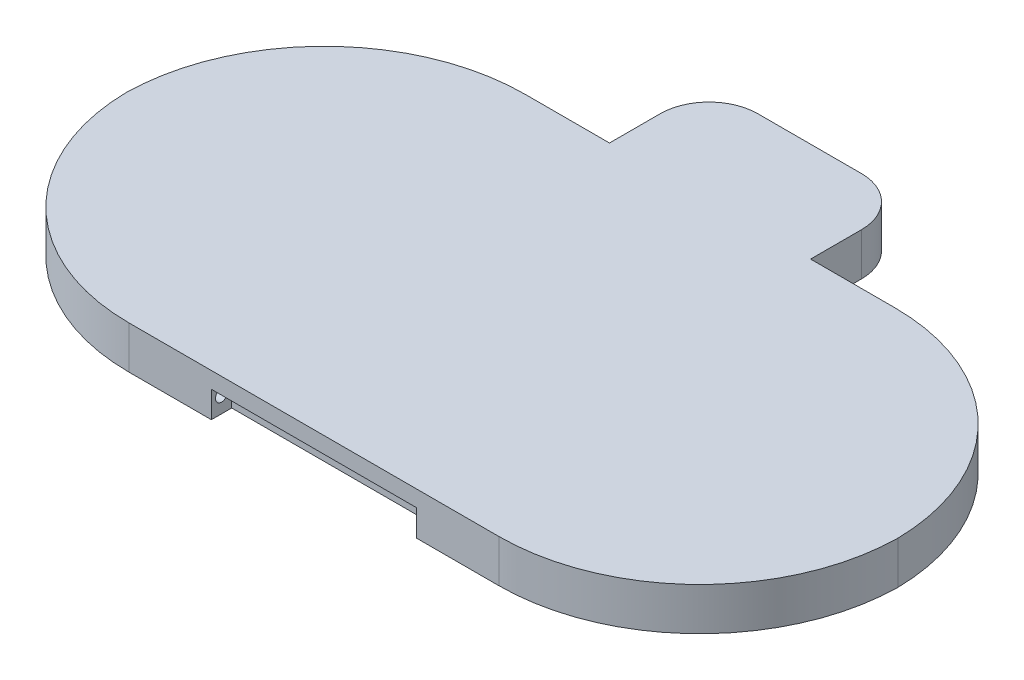
ISO-10303-21;
HEADER;
FILE_DESCRIPTION(('STEP AP214'),'2;1');
FILE_NAME('part.step','',(''),(''),'','','');
FILE_SCHEMA(('AUTOMOTIVE_DESIGN { 1 0 10303 214 1 1 1 1 }'));
ENDSEC;
DATA;
#1=APPLICATION_CONTEXT('core data for automotive mechanical design processes');
#2=APPLICATION_PROTOCOL_DEFINITION('international standard','automotive_design',2000,#1);
#3=PRODUCT_CONTEXT('',#1,'mechanical');
#4=PRODUCT('Part','Part','',(#3));
#5=PRODUCT_RELATED_PRODUCT_CATEGORY('part','',(#4));
#6=PRODUCT_DEFINITION_FORMATION('','',#4);
#7=PRODUCT_DEFINITION_CONTEXT('part definition',#1,'design');
#8=PRODUCT_DEFINITION('design','',#6,#7);
#9=PRODUCT_DEFINITION_SHAPE('','',#8);
#10=(LENGTH_UNIT() NAMED_UNIT(*) SI_UNIT(.MILLI.,.METRE.));
#11=(NAMED_UNIT(*) PLANE_ANGLE_UNIT() SI_UNIT($,.RADIAN.));
#12=(NAMED_UNIT(*) SI_UNIT($,.STERADIAN.) SOLID_ANGLE_UNIT());
#13=UNCERTAINTY_MEASURE_WITH_UNIT(LENGTH_MEASURE(1.E-05),#10,'distance_accuracy_value','');
#14=(GEOMETRIC_REPRESENTATION_CONTEXT(3) GLOBAL_UNCERTAINTY_ASSIGNED_CONTEXT((#13)) GLOBAL_UNIT_ASSIGNED_CONTEXT((#10,
#11,#12)) REPRESENTATION_CONTEXT('',''));
#15=CARTESIAN_POINT('',(0.,0.,0.));
#16=DIRECTION('',(0.,0.,1.));
#17=DIRECTION('',(1.,0.,0.));
#18=AXIS2_PLACEMENT_3D('',#15,#16,#17);
#19=CARTESIAN_POINT('',(190.,21.,-97.5));
#20=DIRECTION('',(0.,0.,1.));
#21=DIRECTION('',(1.,0.,0.));
#22=AXIS2_PLACEMENT_3D('',#19,#20,#21);
#23=PLANE('',#22);
#24=DIRECTION('',(0.,-1.,0.));
#25=VECTOR('',#24,1.);
#26=CARTESIAN_POINT('',(49.5,21.,-97.5));
#27=LINE('',#26,#25);
#28=CARTESIAN_POINT('',(49.5,21.,-97.5));
#29=VERTEX_POINT('',#28);
#30=CARTESIAN_POINT('',(49.5,0.,-97.5));
#31=VERTEX_POINT('',#30);
#32=EDGE_CURVE('E198',#29,#31,#27,.T.);
#33=ORIENTED_EDGE('',*,*,#32,.F.);
#34=DIRECTION('',(-1.,0.,0.));
#35=VECTOR('',#34,1.);
#36=CARTESIAN_POINT('',(190.,21.,-97.5));
#37=LINE('',#36,#35);
#38=CARTESIAN_POINT('',(91.,21.,-97.5));
#39=VERTEX_POINT('',#38);
#40=EDGE_CURVE('E262',#39,#29,#37,.T.);
#41=ORIENTED_EDGE('',*,*,#40,.F.);
#42=DIRECTION('',(0.,-1.,0.));
#43=VECTOR('',#42,1.);
#44=CARTESIAN_POINT('',(91.,21.,-97.5));
#45=LINE('',#44,#43);
#46=CARTESIAN_POINT('',(91.,0.,-97.5));
#47=VERTEX_POINT('',#46);
#48=EDGE_CURVE('E303',#39,#47,#45,.T.);
#49=ORIENTED_EDGE('',*,*,#48,.T.);
#50=DIRECTION('',(-1.,0.,0.));
#51=VECTOR('',#50,1.);
#52=CARTESIAN_POINT('',(190.,0.,-97.5));
#53=LINE('',#52,#51);
#54=EDGE_CURVE('E190',#47,#31,#53,.T.);
#55=ORIENTED_EDGE('',*,*,#54,.T.);
#56=EDGE_LOOP('',(#33,#41,#49,#55));
#57=FACE_BOUND('',#56,.T.);
#58=ADVANCED_FACE('F47',(#57),#23,.F.);
#59=DIRECTION('',(0.,1.,0.));
#60=VECTOR('',#59,1.);
#61=CARTESIAN_POINT('',(-49.5,21.,-97.5));
#62=LINE('',#61,#60);
#63=CARTESIAN_POINT('',(-49.5,0.,-97.5));
#64=VERTEX_POINT('',#63);
#65=CARTESIAN_POINT('',(-49.5,21.,-97.5));
#66=VERTEX_POINT('',#65);
#67=EDGE_CURVE('E175',#64,#66,#62,.T.);
#68=ORIENTED_EDGE('',*,*,#67,.F.);
#69=CARTESIAN_POINT('',(-91.0000000000001,0.,-97.5));
#70=VERTEX_POINT('',#69);
#71=EDGE_CURVE('E182',#64,#70,#53,.T.);
#72=ORIENTED_EDGE('',*,*,#71,.T.);
#73=DIRECTION('',(0.,-1.,0.));
#74=VECTOR('',#73,1.);
#75=CARTESIAN_POINT('',(-91.0000000000001,21.,-97.5));
#76=LINE('',#75,#74);
#77=CARTESIAN_POINT('',(-91.0000000000001,21.,-97.5));
#78=VERTEX_POINT('',#77);
#79=EDGE_CURVE('E307',#70,#78,#76,.F.);
#80=ORIENTED_EDGE('',*,*,#79,.T.);
#81=EDGE_CURVE('E195',#66,#78,#37,.T.);
#82=ORIENTED_EDGE('',*,*,#81,.F.);
#83=EDGE_LOOP('',(#68,#72,#80,#82));
#84=FACE_BOUND('',#83,.T.);
#85=ADVANCED_FACE('F194',(#84),#23,.F.);
#86=CARTESIAN_POINT('',(190.,21.,97.5));
#87=DIRECTION('',(0.,0.,-1.));
#88=DIRECTION('',(-1.,0.,0.));
#89=AXIS2_PLACEMENT_3D('',#86,#87,#88);
#90=PLANE('',#89);
#91=DIRECTION('',(1.,0.,0.));
#92=VECTOR('',#91,1.);
#93=CARTESIAN_POINT('',(190.,0.,97.5));
#94=LINE('',#93,#92);
#95=CARTESIAN_POINT('',(-91.,0.,97.5));
#96=VERTEX_POINT('',#95);
#97=CARTESIAN_POINT('',(-50.5,0.,97.5));
#98=VERTEX_POINT('',#97);
#99=EDGE_CURVE('E191',#96,#98,#94,.T.);
#100=ORIENTED_EDGE('',*,*,#99,.T.);
#101=DIRECTION('',(0.,1.,0.));
#102=VECTOR('',#101,1.);
#103=CARTESIAN_POINT('',(-50.5,21.,97.5));
#104=LINE('',#103,#102);
#105=CARTESIAN_POINT('',(-50.5,13.,97.5));
#106=VERTEX_POINT('',#105);
#107=EDGE_CURVE('E253',#98,#106,#104,.T.);
#108=ORIENTED_EDGE('',*,*,#107,.T.);
#109=DIRECTION('',(1.,0.,0.));
#110=VECTOR('',#109,1.);
#111=CARTESIAN_POINT('',(190.,13.,97.5));
#112=LINE('',#111,#110);
#113=CARTESIAN_POINT('',(50.5,13.,97.5));
#114=VERTEX_POINT('',#113);
#115=EDGE_CURVE('E321',#106,#114,#112,.T.);
#116=ORIENTED_EDGE('',*,*,#115,.T.);
#117=DIRECTION('',(0.,-1.,0.));
#118=VECTOR('',#117,1.);
#119=CARTESIAN_POINT('',(50.5,21.,97.5));
#120=LINE('',#119,#118);
#121=CARTESIAN_POINT('',(50.5,0.,97.5));
#122=VERTEX_POINT('',#121);
#123=EDGE_CURVE('E247',#114,#122,#120,.T.);
#124=ORIENTED_EDGE('',*,*,#123,.T.);
#125=CARTESIAN_POINT('',(91.,0.,97.5));
#126=VERTEX_POINT('',#125);
#127=EDGE_CURVE('E269',#122,#126,#94,.T.);
#128=ORIENTED_EDGE('',*,*,#127,.T.);
#129=DIRECTION('',(0.,-1.,0.));
#130=VECTOR('',#129,1.);
#131=CARTESIAN_POINT('',(91.,21.,97.5));
#132=LINE('',#131,#130);
#133=CARTESIAN_POINT('',(91.,21.,97.5));
#134=VERTEX_POINT('',#133);
#135=EDGE_CURVE('E266',#126,#134,#132,.F.);
#136=ORIENTED_EDGE('',*,*,#135,.T.);
#137=DIRECTION('',(1.,0.,0.));
#138=VECTOR('',#137,1.);
#139=CARTESIAN_POINT('',(190.,21.,97.5));
#140=LINE('',#139,#138);
#141=CARTESIAN_POINT('',(-91.,21.,97.5));
#142=VERTEX_POINT('',#141);
#143=EDGE_CURVE('E258',#142,#134,#140,.T.);
#144=ORIENTED_EDGE('',*,*,#143,.F.);
#145=DIRECTION('',(0.,-1.,0.));
#146=VECTOR('',#145,1.);
#147=CARTESIAN_POINT('',(-91.,21.,97.5));
#148=LINE('',#147,#146);
#149=EDGE_CURVE('E275',#142,#96,#148,.T.);
#150=ORIENTED_EDGE('',*,*,#149,.T.);
#151=EDGE_LOOP('',(#100,#108,#116,#124,#128,#136,#144,#150));
#152=FACE_BOUND('',#151,.T.);
#153=ADVANCED_FACE('F385',(#152),#90,.F.);
#154=CARTESIAN_POINT('',(0.,21.,0.));
#155=DIRECTION('',(0.,-1.,0.));
#156=DIRECTION('',(0.,0.,-1.));
#157=AXIS2_PLACEMENT_3D('',#154,#155,#156);
#158=PLANE('',#157);
#159=DIRECTION('',(1.,0.,0.));
#160=VECTOR('',#159,1.);
#161=CARTESIAN_POINT('',(49.5,21.,-146.5));
#162=LINE('',#161,#160);
#163=CARTESIAN_POINT('',(-25.5,21.,-146.5));
#164=VERTEX_POINT('',#163);
#165=CARTESIAN_POINT('',(25.5,21.,-146.5));
#166=VERTEX_POINT('',#165);
#167=EDGE_CURVE('E203',#164,#166,#162,.T.);
#168=ORIENTED_EDGE('',*,*,#167,.F.);
#169=CARTESIAN_POINT('',(-25.5,21.,-122.5));
#170=DIRECTION('',(0.,-1.,0.));
#171=DIRECTION('',(0.,0.,-1.));
#172=AXIS2_PLACEMENT_3D('',#169,#170,#171);
#173=CIRCLE('',#172,24.);
#174=CARTESIAN_POINT('',(-49.5,21.,-122.5));
#175=VERTEX_POINT('',#174);
#176=EDGE_CURVE('E352',#164,#175,#173,.F.);
#177=ORIENTED_EDGE('',*,*,#176,.T.);
#178=DIRECTION('',(0.,0.,1.));
#179=VECTOR('',#178,1.);
#180=CARTESIAN_POINT('',(-49.5,21.,-146.5));
#181=LINE('',#180,#179);
#182=EDGE_CURVE('E179',#175,#66,#181,.T.);
#183=ORIENTED_EDGE('',*,*,#182,.T.);
#184=ORIENTED_EDGE('',*,*,#81,.T.);
#185=CARTESIAN_POINT('',(-91.,21.,1.5));
#186=DIRECTION('',(0.,-1.,0.));
#187=DIRECTION('',(0.,0.,-1.));
#188=AXIS2_PLACEMENT_3D('',#185,#186,#187);
#189=CIRCLE('',#188,99.);
#190=CARTESIAN_POINT('',(-189.988635711378,21.,-9.02489888376934E-13));
#191=VERTEX_POINT('',#190);
#192=EDGE_CURVE('E297',#78,#191,#189,.F.);
#193=ORIENTED_EDGE('',*,*,#192,.T.);
#194=CARTESIAN_POINT('',(-91.,21.,-1.49999999999997));
#195=DIRECTION('',(0.,-1.,0.));
#196=DIRECTION('',(0.,0.,-1.));
#197=AXIS2_PLACEMENT_3D('',#194,#195,#196);
#198=CIRCLE('',#197,99.);
#199=EDGE_CURVE('E300',#191,#142,#198,.F.);
#200=ORIENTED_EDGE('',*,*,#199,.T.);
#201=ORIENTED_EDGE('',*,*,#143,.T.);
#202=CARTESIAN_POINT('',(91.,21.,-1.5));
#203=DIRECTION('',(0.,-1.,0.));
#204=DIRECTION('',(0.,0.,-1.));
#205=AXIS2_PLACEMENT_3D('',#202,#203,#204);
#206=CIRCLE('',#205,99.);
#207=CARTESIAN_POINT('',(189.988635711378,21.,0.));
#208=VERTEX_POINT('',#207);
#209=EDGE_CURVE('E291',#134,#208,#206,.F.);
#210=ORIENTED_EDGE('',*,*,#209,.T.);
#211=CARTESIAN_POINT('',(91.,21.,1.49999999999998));
#212=DIRECTION('',(0.,-1.,0.));
#213=DIRECTION('',(0.,0.,-1.));
#214=AXIS2_PLACEMENT_3D('',#211,#212,#213);
#215=CIRCLE('',#214,99.);
#216=EDGE_CURVE('E294',#208,#39,#215,.F.);
#217=ORIENTED_EDGE('',*,*,#216,.T.);
#218=ORIENTED_EDGE('',*,*,#40,.T.);
#219=DIRECTION('',(0.,0.,1.));
#220=VECTOR('',#219,1.);
#221=CARTESIAN_POINT('',(49.5,21.,-146.5));
#222=LINE('',#221,#220);
#223=CARTESIAN_POINT('',(49.5,21.,-122.5));
#224=VERTEX_POINT('',#223);
#225=EDGE_CURVE('E209',#224,#29,#222,.T.);
#226=ORIENTED_EDGE('',*,*,#225,.F.);
#227=CARTESIAN_POINT('',(25.5,21.,-122.5));
#228=DIRECTION('',(0.,-1.,0.));
#229=DIRECTION('',(0.,0.,-1.));
#230=AXIS2_PLACEMENT_3D('',#227,#228,#229);
#231=CIRCLE('',#230,24.);
#232=EDGE_CURVE('E349',#224,#166,#231,.F.);
#233=ORIENTED_EDGE('',*,*,#232,.T.);
#234=EDGE_LOOP('',(#168,#177,#183,#184,#193,#200,#201,#210,#217,#218,#226,#233));
#235=FACE_BOUND('',#234,.T.);
#236=ADVANCED_FACE('F368',(#235),#158,.F.);
#237=CARTESIAN_POINT('',(0.,0.,0.));
#238=DIRECTION('',(0.,-1.,0.));
#239=DIRECTION('',(0.,0.,-1.));
#240=AXIS2_PLACEMENT_3D('',#237,#238,#239);
#241=PLANE('',#240);
#242=DIRECTION('',(0.,0.,1.));
#243=VECTOR('',#242,1.);
#244=CARTESIAN_POINT('',(-49.5,0.,-146.5));
#245=LINE('',#244,#243);
#246=CARTESIAN_POINT('',(-49.5,0.,-122.5));
#247=VERTEX_POINT('',#246);
#248=EDGE_CURVE('E171',#247,#64,#245,.T.);
#249=ORIENTED_EDGE('',*,*,#248,.F.);
#250=CARTESIAN_POINT('',(-25.5,0.,-122.5));
#251=DIRECTION('',(0.,-1.,0.));
#252=DIRECTION('',(0.,0.,-1.));
#253=AXIS2_PLACEMENT_3D('',#250,#251,#252);
#254=CIRCLE('',#253,24.);
#255=CARTESIAN_POINT('',(-25.5,0.,-146.5));
#256=VERTEX_POINT('',#255);
#257=EDGE_CURVE('E56',#247,#256,#254,.T.);
#258=ORIENTED_EDGE('',*,*,#257,.T.);
#259=DIRECTION('',(-1.,0.,0.));
#260=VECTOR('',#259,1.);
#261=CARTESIAN_POINT('',(49.5,0.,-146.5));
#262=LINE('',#261,#260);
#263=CARTESIAN_POINT('',(25.5,0.,-146.5));
#264=VERTEX_POINT('',#263);
#265=EDGE_CURVE('E197',#264,#256,#262,.T.);
#266=ORIENTED_EDGE('',*,*,#265,.F.);
#267=CARTESIAN_POINT('',(25.5,0.,-122.5));
#268=DIRECTION('',(0.,-1.,0.));
#269=DIRECTION('',(0.,0.,-1.));
#270=AXIS2_PLACEMENT_3D('',#267,#268,#269);
#271=CIRCLE('',#270,24.);
#272=CARTESIAN_POINT('',(49.5,0.,-122.5));
#273=VERTEX_POINT('',#272);
#274=EDGE_CURVE('E63',#264,#273,#271,.T.);
#275=ORIENTED_EDGE('',*,*,#274,.T.);
#276=DIRECTION('',(0.,0.,1.));
#277=VECTOR('',#276,1.);
#278=CARTESIAN_POINT('',(49.5,0.,-146.5));
#279=LINE('',#278,#277);
#280=EDGE_CURVE('E178',#273,#31,#279,.T.);
#281=ORIENTED_EDGE('',*,*,#280,.T.);
#282=ORIENTED_EDGE('',*,*,#54,.F.);
#283=CARTESIAN_POINT('',(91.,0.,1.49999999999998));
#284=DIRECTION('',(0.,-1.,0.));
#285=DIRECTION('',(0.,0.,-1.));
#286=AXIS2_PLACEMENT_3D('',#283,#284,#285);
#287=CIRCLE('',#286,99.);
#288=CARTESIAN_POINT('',(189.988635711378,0.,0.));
#289=VERTEX_POINT('',#288);
#290=EDGE_CURVE('E283',#47,#289,#287,.T.);
#291=ORIENTED_EDGE('',*,*,#290,.T.);
#292=CARTESIAN_POINT('',(91.,0.,-1.5));
#293=DIRECTION('',(0.,-1.,0.));
#294=DIRECTION('',(0.,0.,-1.));
#295=AXIS2_PLACEMENT_3D('',#292,#293,#294);
#296=CIRCLE('',#295,99.);
#297=EDGE_CURVE('E279',#289,#126,#296,.T.);
#298=ORIENTED_EDGE('',*,*,#297,.T.);
#299=ORIENTED_EDGE('',*,*,#127,.F.);
#300=DIRECTION('',(0.,0.,1.));
#301=VECTOR('',#300,1.);
#302=CARTESIAN_POINT('',(50.5,0.,107.5));
#303=LINE('',#302,#301);
#304=CARTESIAN_POINT('',(50.5,0.,87.5));
#305=VERTEX_POINT('',#304);
#306=EDGE_CURVE('E235',#305,#122,#303,.T.);
#307=ORIENTED_EDGE('',*,*,#306,.F.);
#308=DIRECTION('',(1.,0.,0.));
#309=VECTOR('',#308,1.);
#310=CARTESIAN_POINT('',(50.5,0.,87.5));
#311=LINE('',#310,#309);
#312=CARTESIAN_POINT('',(-50.5,0.,87.5));
#313=VERTEX_POINT('',#312);
#314=EDGE_CURVE('E229',#313,#305,#311,.T.);
#315=ORIENTED_EDGE('',*,*,#314,.F.);
#316=DIRECTION('',(0.,0.,-1.));
#317=VECTOR('',#316,1.);
#318=CARTESIAN_POINT('',(-50.5,0.,0.));
#319=LINE('',#318,#317);
#320=EDGE_CURVE('E310',#98,#313,#319,.T.);
#321=ORIENTED_EDGE('',*,*,#320,.F.);
#322=ORIENTED_EDGE('',*,*,#99,.F.);
#323=CARTESIAN_POINT('',(-91.,0.,-1.49999999999997));
#324=DIRECTION('',(0.,-1.,0.));
#325=DIRECTION('',(0.,0.,-1.));
#326=AXIS2_PLACEMENT_3D('',#323,#324,#325);
#327=CIRCLE('',#326,99.);
#328=CARTESIAN_POINT('',(-189.988635711378,0.,-9.02489888376934E-13));
#329=VERTEX_POINT('',#328);
#330=EDGE_CURVE('E288',#96,#329,#327,.T.);
#331=ORIENTED_EDGE('',*,*,#330,.T.);
#332=CARTESIAN_POINT('',(-91.,0.,1.5));
#333=DIRECTION('',(0.,-1.,0.));
#334=DIRECTION('',(0.,0.,-1.));
#335=AXIS2_PLACEMENT_3D('',#332,#333,#334);
#336=CIRCLE('',#335,99.);
#337=EDGE_CURVE('E185',#329,#70,#336,.T.);
#338=ORIENTED_EDGE('',*,*,#337,.T.);
#339=ORIENTED_EDGE('',*,*,#71,.F.);
#340=EDGE_LOOP('',(#249,#258,#266,#275,#281,#282,#291,#298,#299,#307,#315,#321,#322,#331,#338,#339));
#341=FACE_BOUND('',#340,.T.);
#342=ADVANCED_FACE('F183',(#341),#241,.T.);
#343=CARTESIAN_POINT('',(-91.,21.,1.5));
#344=DIRECTION('',(0.,-1.,0.));
#345=DIRECTION('',(0.,0.,-1.));
#346=AXIS2_PLACEMENT_3D('',#343,#344,#345);
#347=CYLINDRICAL_SURFACE('',#346,99.);
#348=DIRECTION('',(0.,-1.,0.));
#349=VECTOR('',#348,1.);
#350=CARTESIAN_POINT('',(-189.988635711379,10.5,-9.02923569245928E-13));
#351=LINE('',#350,#349);
#352=EDGE_CURVE('E311',#191,#329,#351,.T.);
#353=ORIENTED_EDGE('',*,*,#352,.F.);
#354=ORIENTED_EDGE('',*,*,#192,.F.);
#355=ORIENTED_EDGE('',*,*,#79,.F.);
#356=ORIENTED_EDGE('',*,*,#337,.F.);
#357=EDGE_LOOP('',(#353,#354,#355,#356));
#358=FACE_BOUND('',#357,.T.);
#359=ADVANCED_FACE('F377',(#358),#347,.T.);
#360=CARTESIAN_POINT('',(-91.,21.,-1.49999999999997));
#361=DIRECTION('',(0.,-1.,0.));
#362=DIRECTION('',(0.,0.,-1.));
#363=AXIS2_PLACEMENT_3D('',#360,#361,#362);
#364=CYLINDRICAL_SURFACE('',#363,99.);
#365=ORIENTED_EDGE('',*,*,#199,.F.);
#366=ORIENTED_EDGE('',*,*,#352,.T.);
#367=ORIENTED_EDGE('',*,*,#330,.F.);
#368=ORIENTED_EDGE('',*,*,#149,.F.);
#369=EDGE_LOOP('',(#365,#366,#367,#368));
#370=FACE_BOUND('',#369,.T.);
#371=ADVANCED_FACE('F381',(#370),#364,.T.);
#372=CARTESIAN_POINT('',(91.,21.,-1.5));
#373=DIRECTION('',(0.,-1.,0.));
#374=DIRECTION('',(0.,0.,-1.));
#375=AXIS2_PLACEMENT_3D('',#372,#373,#374);
#376=CYLINDRICAL_SURFACE('',#375,99.);
#377=DIRECTION('',(0.,-1.,0.));
#378=VECTOR('',#377,1.);
#379=CARTESIAN_POINT('',(189.988635711378,10.5,0.));
#380=LINE('',#379,#378);
#381=EDGE_CURVE('E257',#208,#289,#380,.T.);
#382=ORIENTED_EDGE('',*,*,#381,.F.);
#383=ORIENTED_EDGE('',*,*,#209,.F.);
#384=ORIENTED_EDGE('',*,*,#135,.F.);
#385=ORIENTED_EDGE('',*,*,#297,.F.);
#386=EDGE_LOOP('',(#382,#383,#384,#385));
#387=FACE_BOUND('',#386,.T.);
#388=ADVANCED_FACE('F392',(#387),#376,.T.);
#389=CARTESIAN_POINT('',(91.,21.,1.49999999999998));
#390=DIRECTION('',(0.,-1.,0.));
#391=DIRECTION('',(0.,0.,-1.));
#392=AXIS2_PLACEMENT_3D('',#389,#390,#391);
#393=CYLINDRICAL_SURFACE('',#392,99.);
#394=ORIENTED_EDGE('',*,*,#216,.F.);
#395=ORIENTED_EDGE('',*,*,#381,.T.);
#396=ORIENTED_EDGE('',*,*,#290,.F.);
#397=ORIENTED_EDGE('',*,*,#48,.F.);
#398=EDGE_LOOP('',(#394,#395,#396,#397));
#399=FACE_BOUND('',#398,.T.);
#400=ADVANCED_FACE('F400',(#399),#393,.T.);
#401=CARTESIAN_POINT('',(0.,13.,0.));
#402=DIRECTION('',(0.,1.,0.));
#403=DIRECTION('',(0.,0.,1.));
#404=AXIS2_PLACEMENT_3D('',#401,#402,#403);
#405=PLANE('',#404);
#406=DIRECTION('',(0.,0.,-1.));
#407=VECTOR('',#406,1.);
#408=CARTESIAN_POINT('',(-50.5,13.,107.5));
#409=LINE('',#408,#407);
#410=CARTESIAN_POINT('',(-50.5,13.,91.5));
#411=VERTEX_POINT('',#410);
#412=EDGE_CURVE('E230',#106,#411,#409,.T.);
#413=ORIENTED_EDGE('',*,*,#412,.T.);
#414=DIRECTION('',(1.,0.,0.));
#415=VECTOR('',#414,1.);
#416=CARTESIAN_POINT('',(50.5,13.,91.5));
#417=LINE('',#416,#415);
#418=CARTESIAN_POINT('',(50.5,13.,91.5));
#419=VERTEX_POINT('',#418);
#420=EDGE_CURVE('E325',#411,#419,#417,.T.);
#421=ORIENTED_EDGE('',*,*,#420,.T.);
#422=DIRECTION('',(0.,0.,1.));
#423=VECTOR('',#422,1.);
#424=CARTESIAN_POINT('',(50.5,13.,107.5));
#425=LINE('',#424,#423);
#426=EDGE_CURVE('E234',#419,#114,#425,.T.);
#427=ORIENTED_EDGE('',*,*,#426,.T.);
#428=ORIENTED_EDGE('',*,*,#115,.F.);
#429=EDGE_LOOP('',(#413,#421,#427,#428));
#430=FACE_BOUND('',#429,.T.);
#431=ADVANCED_FACE('F425',(#430),#405,.F.);
#432=CARTESIAN_POINT('',(-50.5,13.,107.5));
#433=DIRECTION('',(-1.,0.,0.));
#434=DIRECTION('',(0.,0.,1.));
#435=AXIS2_PLACEMENT_3D('',#432,#433,#434);
#436=PLANE('',#435);
#437=CARTESIAN_POINT('',(-50.5,8.,92.5));
#438=DIRECTION('',(-1.,0.,0.));
#439=DIRECTION('',(0.,0.,1.));
#440=AXIS2_PLACEMENT_3D('',#437,#438,#439);
#441=CIRCLE('',#440,3.00000000000001);
#442=CARTESIAN_POINT('',(-50.5,8.,95.5));
#443=VERTEX_POINT('',#442);
#444=EDGE_CURVE('E225',#443,#443,#441,.F.);
#445=ORIENTED_EDGE('',*,*,#444,.F.);
#446=EDGE_LOOP('',(#445));
#447=FACE_BOUND('',#446,.T.);
#448=DIRECTION('',(0.,-1.,0.));
#449=VECTOR('',#448,1.);
#450=CARTESIAN_POINT('',(-50.5,13.,87.5));
#451=LINE('',#450,#449);
#452=CARTESIAN_POINT('',(-50.5,9.,87.5));
#453=VERTEX_POINT('',#452);
#454=EDGE_CURVE('E238',#453,#313,#451,.T.);
#455=ORIENTED_EDGE('',*,*,#454,.F.);
#456=CARTESIAN_POINT('',(-50.5,9.,91.5));
#457=DIRECTION('',(-1.,0.,0.));
#458=DIRECTION('',(0.,0.,1.));
#459=AXIS2_PLACEMENT_3D('',#456,#457,#458);
#460=CIRCLE('',#459,4.);
#461=EDGE_CURVE('E335',#453,#411,#460,.F.);
#462=ORIENTED_EDGE('',*,*,#461,.T.);
#463=ORIENTED_EDGE('',*,*,#412,.F.);
#464=ORIENTED_EDGE('',*,*,#107,.F.);
#465=ORIENTED_EDGE('',*,*,#320,.T.);
#466=EDGE_LOOP('',(#455,#462,#463,#464,#465));
#467=FACE_BOUND('',#466,.T.);
#468=ADVANCED_FACE('F449',(#447,#467),#436,.F.);
#469=CARTESIAN_POINT('',(50.5,13.,107.5));
#470=DIRECTION('',(1.,0.,0.));
#471=DIRECTION('',(0.,0.,-1.));
#472=AXIS2_PLACEMENT_3D('',#469,#470,#471);
#473=PLANE('',#472);
#474=CARTESIAN_POINT('',(50.5,8.,92.5));
#475=DIRECTION('',(1.,0.,0.));
#476=DIRECTION('',(0.,0.,-1.));
#477=AXIS2_PLACEMENT_3D('',#474,#475,#476);
#478=CIRCLE('',#477,3.00000000000001);
#479=CARTESIAN_POINT('',(50.5,8.,89.5));
#480=VERTEX_POINT('',#479);
#481=EDGE_CURVE('E224',#480,#480,#478,.F.);
#482=ORIENTED_EDGE('',*,*,#481,.F.);
#483=EDGE_LOOP('',(#482));
#484=FACE_BOUND('',#483,.T.);
#485=ORIENTED_EDGE('',*,*,#426,.F.);
#486=CARTESIAN_POINT('',(50.5,9.,91.5));
#487=DIRECTION('',(1.,0.,0.));
#488=DIRECTION('',(0.,0.,-1.));
#489=AXIS2_PLACEMENT_3D('',#486,#487,#488);
#490=CIRCLE('',#489,4.);
#491=CARTESIAN_POINT('',(50.5,9.,87.5));
#492=VERTEX_POINT('',#491);
#493=EDGE_CURVE('E329',#419,#492,#490,.F.);
#494=ORIENTED_EDGE('',*,*,#493,.T.);
#495=DIRECTION('',(0.,-1.,0.));
#496=VECTOR('',#495,1.);
#497=CARTESIAN_POINT('',(50.5,13.,87.5));
#498=LINE('',#497,#496);
#499=EDGE_CURVE('E244',#492,#305,#498,.T.);
#500=ORIENTED_EDGE('',*,*,#499,.T.);
#501=ORIENTED_EDGE('',*,*,#306,.T.);
#502=ORIENTED_EDGE('',*,*,#123,.F.);
#503=EDGE_LOOP('',(#485,#494,#500,#501,#502));
#504=FACE_BOUND('',#503,.T.);
#505=ADVANCED_FACE('F440',(#484,#504),#473,.F.);
#506=CARTESIAN_POINT('',(50.5,13.,87.5));
#507=DIRECTION('',(0.,0.,-1.));
#508=DIRECTION('',(-1.,0.,0.));
#509=AXIS2_PLACEMENT_3D('',#506,#507,#508);
#510=PLANE('',#509);
#511=ORIENTED_EDGE('',*,*,#499,.F.);
#512=DIRECTION('',(1.,0.,0.));
#513=VECTOR('',#512,1.);
#514=CARTESIAN_POINT('',(-50.5,9.,87.5));
#515=LINE('',#514,#513);
#516=EDGE_CURVE('E332',#492,#453,#515,.F.);
#517=ORIENTED_EDGE('',*,*,#516,.T.);
#518=ORIENTED_EDGE('',*,*,#454,.T.);
#519=ORIENTED_EDGE('',*,*,#314,.T.);
#520=EDGE_LOOP('',(#511,#517,#518,#519));
#521=FACE_BOUND('',#520,.T.);
#522=ADVANCED_FACE('F431',(#521),#510,.F.);
#523=CARTESIAN_POINT('',(0.,9.,91.5));
#524=DIRECTION('',(-1.,0.,0.));
#525=DIRECTION('',(0.,0.,1.));
#526=AXIS2_PLACEMENT_3D('',#523,#524,#525);
#527=CYLINDRICAL_SURFACE('',#526,4.);
#528=ORIENTED_EDGE('',*,*,#461,.F.);
#529=ORIENTED_EDGE('',*,*,#516,.F.);
#530=ORIENTED_EDGE('',*,*,#493,.F.);
#531=ORIENTED_EDGE('',*,*,#420,.F.);
#532=EDGE_LOOP('',(#528,#529,#530,#531));
#533=FACE_BOUND('',#532,.T.);
#534=ADVANCED_FACE('F428',(#533),#527,.F.);
#535=CARTESIAN_POINT('',(59.5,8.,92.5));
#536=DIRECTION('',(1.,0.,0.));
#537=DIRECTION('',(0.,0.,-1.));
#538=AXIS2_PLACEMENT_3D('',#535,#536,#537);
#539=PLANE('',#538);
#540=CARTESIAN_POINT('',(59.5,8.,92.5));
#541=DIRECTION('',(1.,0.,0.));
#542=DIRECTION('',(0.,0.,-1.));
#543=AXIS2_PLACEMENT_3D('',#540,#541,#542);
#544=CIRCLE('',#543,3.00000000000001);
#545=CARTESIAN_POINT('',(59.5,8.,89.5));
#546=VERTEX_POINT('',#545);
#547=EDGE_CURVE('E220',#546,#546,#544,.T.);
#548=ORIENTED_EDGE('',*,*,#547,.F.);
#549=EDGE_LOOP('',(#548));
#550=FACE_BOUND('',#549,.T.);
#551=ADVANCED_FACE('F430',(#550),#539,.F.);
#552=CARTESIAN_POINT('',(59.5,8.,92.5));
#553=DIRECTION('',(-1.,0.,0.));
#554=DIRECTION('',(0.,0.,1.));
#555=AXIS2_PLACEMENT_3D('',#552,#553,#554);
#556=CYLINDRICAL_SURFACE('',#555,3.00000000000001);
#557=ORIENTED_EDGE('',*,*,#547,.T.);
#558=EDGE_LOOP('',(#557));
#559=FACE_BOUND('',#558,.T.);
#560=ORIENTED_EDGE('',*,*,#481,.T.);
#561=EDGE_LOOP('',(#560));
#562=FACE_BOUND('',#561,.T.);
#563=ADVANCED_FACE('F437',(#559,#562),#556,.F.);
#564=CARTESIAN_POINT('',(-60.5,8.,92.5));
#565=DIRECTION('',(1.,0.,0.));
#566=DIRECTION('',(0.,0.,-1.));
#567=AXIS2_PLACEMENT_3D('',#564,#565,#566);
#568=CIRCLE('',#567,3.00000000000001);
#569=CARTESIAN_POINT('',(-60.5,8.,89.5));
#570=VERTEX_POINT('',#569);
#571=EDGE_CURVE('E216',#570,#570,#568,.T.);
#572=ORIENTED_EDGE('',*,*,#571,.F.);
#573=EDGE_LOOP('',(#572));
#574=FACE_BOUND('',#573,.T.);
#575=ORIENTED_EDGE('',*,*,#444,.T.);
#576=EDGE_LOOP('',(#575));
#577=FACE_BOUND('',#576,.T.);
#578=ADVANCED_FACE('F525',(#574,#577),#556,.F.);
#579=CARTESIAN_POINT('',(-60.5,8.,92.5));
#580=DIRECTION('',(1.,0.,0.));
#581=DIRECTION('',(0.,0.,-1.));
#582=AXIS2_PLACEMENT_3D('',#579,#580,#581);
#583=PLANE('',#582);
#584=ORIENTED_EDGE('',*,*,#571,.T.);
#585=EDGE_LOOP('',(#584));
#586=FACE_BOUND('',#585,.T.);
#587=ADVANCED_FACE('F535',(#586),#583,.T.);
#588=CARTESIAN_POINT('',(49.5,21.,-146.5));
#589=DIRECTION('',(-1.,0.,0.));
#590=DIRECTION('',(0.,0.,1.));
#591=AXIS2_PLACEMENT_3D('',#588,#589,#590);
#592=PLANE('',#591);
#593=ORIENTED_EDGE('',*,*,#280,.F.);
#594=DIRECTION('',(0.,-1.,0.));
#595=VECTOR('',#594,1.);
#596=CARTESIAN_POINT('',(49.5,21.,-122.5));
#597=LINE('',#596,#595);
#598=EDGE_CURVE('E11',#273,#224,#597,.F.);
#599=ORIENTED_EDGE('',*,*,#598,.T.);
#600=ORIENTED_EDGE('',*,*,#225,.T.);
#601=ORIENTED_EDGE('',*,*,#32,.T.);
#602=EDGE_LOOP('',(#593,#599,#600,#601));
#603=FACE_BOUND('',#602,.T.);
#604=ADVANCED_FACE('F402',(#603),#592,.F.);
#605=CARTESIAN_POINT('',(-49.5,21.,-146.5));
#606=DIRECTION('',(1.,0.,0.));
#607=DIRECTION('',(0.,0.,-1.));
#608=AXIS2_PLACEMENT_3D('',#605,#606,#607);
#609=PLANE('',#608);
#610=ORIENTED_EDGE('',*,*,#182,.F.);
#611=DIRECTION('',(0.,1.,0.));
#612=VECTOR('',#611,1.);
#613=CARTESIAN_POINT('',(-49.5,0.,-122.5));
#614=LINE('',#613,#612);
#615=EDGE_CURVE('E73',#175,#247,#614,.F.);
#616=ORIENTED_EDGE('',*,*,#615,.T.);
#617=ORIENTED_EDGE('',*,*,#248,.T.);
#618=ORIENTED_EDGE('',*,*,#67,.T.);
#619=EDGE_LOOP('',(#610,#616,#617,#618));
#620=FACE_BOUND('',#619,.T.);
#621=ADVANCED_FACE('F173',(#620),#609,.F.);
#622=CARTESIAN_POINT('',(0.,0.,-146.5));
#623=DIRECTION('',(0.,0.,-1.));
#624=DIRECTION('',(-1.,0.,0.));
#625=AXIS2_PLACEMENT_3D('',#622,#623,#624);
#626=PLANE('',#625);
#627=ORIENTED_EDGE('',*,*,#265,.T.);
#628=DIRECTION('',(0.,1.,0.));
#629=VECTOR('',#628,1.);
#630=CARTESIAN_POINT('',(-25.5,21.,-146.5));
#631=LINE('',#630,#629);
#632=EDGE_CURVE('E345',#256,#164,#631,.T.);
#633=ORIENTED_EDGE('',*,*,#632,.T.);
#634=ORIENTED_EDGE('',*,*,#167,.T.);
#635=DIRECTION('',(0.,-1.,0.));
#636=VECTOR('',#635,1.);
#637=CARTESIAN_POINT('',(25.5,0.,-146.5));
#638=LINE('',#637,#636);
#639=EDGE_CURVE('E338',#166,#264,#638,.T.);
#640=ORIENTED_EDGE('',*,*,#639,.T.);
#641=EDGE_LOOP('',(#627,#633,#634,#640));
#642=FACE_BOUND('',#641,.T.);
#643=ADVANCED_FACE('F362',(#642),#626,.T.);
#644=CARTESIAN_POINT('',(-25.5,0.,-122.5));
#645=DIRECTION('',(0.,-1.,0.));
#646=DIRECTION('',(0.,0.,-1.));
#647=AXIS2_PLACEMENT_3D('',#644,#645,#646);
#648=CYLINDRICAL_SURFACE('',#647,24.);
#649=ORIENTED_EDGE('',*,*,#257,.F.);
#650=ORIENTED_EDGE('',*,*,#615,.F.);
#651=ORIENTED_EDGE('',*,*,#176,.F.);
#652=ORIENTED_EDGE('',*,*,#632,.F.);
#653=EDGE_LOOP('',(#649,#650,#651,#652));
#654=FACE_BOUND('',#653,.T.);
#655=ADVANCED_FACE('F366',(#654),#648,.T.);
#656=CARTESIAN_POINT('',(25.5,0.,-122.5));
#657=DIRECTION('',(0.,1.,0.));
#658=DIRECTION('',(0.,0.,1.));
#659=AXIS2_PLACEMENT_3D('',#656,#657,#658);
#660=CYLINDRICAL_SURFACE('',#659,24.);
#661=ORIENTED_EDGE('',*,*,#232,.F.);
#662=ORIENTED_EDGE('',*,*,#598,.F.);
#663=ORIENTED_EDGE('',*,*,#274,.F.);
#664=ORIENTED_EDGE('',*,*,#639,.F.);
#665=EDGE_LOOP('',(#661,#662,#663,#664));
#666=FACE_BOUND('',#665,.T.);
#667=ADVANCED_FACE('F49',(#666),#660,.T.);
#668=CLOSED_SHELL('',(#58,#85,#153,#236,#342,#359,#371,#388,#400,#431,#468,#505,#522,#534,#551,
#563,#578,#587,#604,#621,#643,#655,#667));
#669=MANIFOLD_SOLID_BREP('B2',#668);
#670=ADVANCED_BREP_SHAPE_REPRESENTATION('',(#18,#669),#14);
#671=SHAPE_DEFINITION_REPRESENTATION(#9,#670);
ENDSEC;
END-ISO-10303-21;
